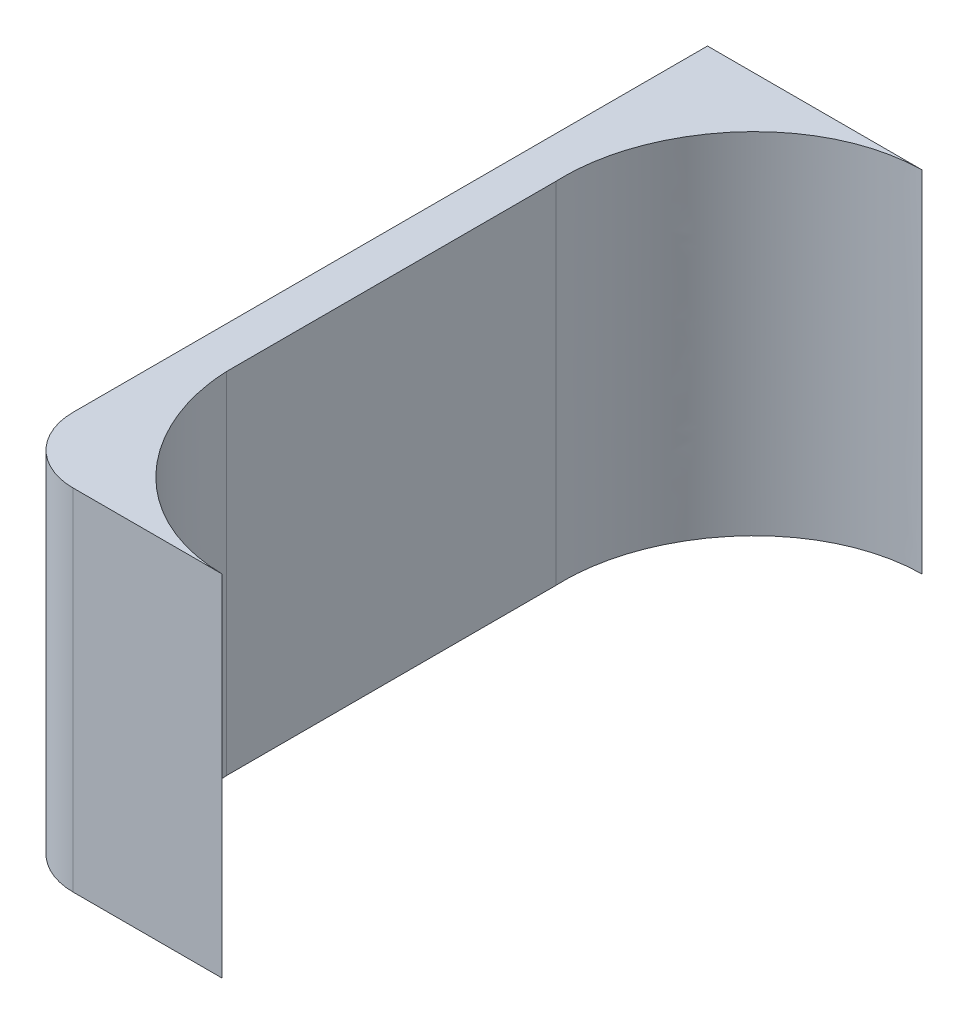
ISO-10303-21;
HEADER;
FILE_DESCRIPTION(('STEP AP214'),'2;1');
FILE_NAME('part.step','',(''),(''),'','','');
FILE_SCHEMA(('AUTOMOTIVE_DESIGN { 1 0 10303 214 1 1 1 1 }'));
ENDSEC;
DATA;
#1=APPLICATION_CONTEXT('core data for automotive mechanical design processes');
#2=APPLICATION_PROTOCOL_DEFINITION('international standard','automotive_design',2000,#1);
#3=PRODUCT_CONTEXT('',#1,'mechanical');
#4=PRODUCT('Part','Part','',(#3));
#5=PRODUCT_RELATED_PRODUCT_CATEGORY('part','',(#4));
#6=PRODUCT_DEFINITION_FORMATION('','',#4);
#7=PRODUCT_DEFINITION_CONTEXT('part definition',#1,'design');
#8=PRODUCT_DEFINITION('design','',#6,#7);
#9=PRODUCT_DEFINITION_SHAPE('','',#8);
#10=(LENGTH_UNIT() NAMED_UNIT(*) SI_UNIT(.MILLI.,.METRE.));
#11=(NAMED_UNIT(*) PLANE_ANGLE_UNIT() SI_UNIT($,.RADIAN.));
#12=(NAMED_UNIT(*) SI_UNIT($,.STERADIAN.) SOLID_ANGLE_UNIT());
#13=UNCERTAINTY_MEASURE_WITH_UNIT(LENGTH_MEASURE(1.E-05),#10,'distance_accuracy_value','');
#14=(GEOMETRIC_REPRESENTATION_CONTEXT(3) GLOBAL_UNCERTAINTY_ASSIGNED_CONTEXT((#13)) GLOBAL_UNIT_ASSIGNED_CONTEXT((#10,
#11,#12)) REPRESENTATION_CONTEXT('',''));
#15=CARTESIAN_POINT('',(0.,0.,0.));
#16=DIRECTION('',(0.,0.,1.));
#17=DIRECTION('',(1.,0.,0.));
#18=AXIS2_PLACEMENT_3D('',#15,#16,#17);
#19=CARTESIAN_POINT('',(0.,0.,160.));
#20=DIRECTION('',(0.,0.,1.));
#21=DIRECTION('',(1.,0.,0.));
#22=AXIS2_PLACEMENT_3D('',#19,#20,#21);
#23=PLANE('',#22);
#24=DIRECTION('',(-1.,0.,0.));
#25=VECTOR('',#24,1.);
#26=CARTESIAN_POINT('',(-30.,40.,160.));
#27=LINE('',#26,#25);
#28=CARTESIAN_POINT('',(19.,40.,160.));
#29=VERTEX_POINT('',#28);
#30=CARTESIAN_POINT('',(-15.,40.,160.));
#31=VERTEX_POINT('',#30);
#32=EDGE_CURVE('E178',#29,#31,#27,.T.);
#33=ORIENTED_EDGE('',*,*,#32,.T.);
#34=DIRECTION('',(0.,-1.,0.));
#35=VECTOR('',#34,1.);
#36=CARTESIAN_POINT('',(-15.,-40.,160.));
#37=LINE('',#36,#35);
#38=CARTESIAN_POINT('',(-15.,-40.,160.));
#39=VERTEX_POINT('',#38);
#40=EDGE_CURVE('E165',#31,#39,#37,.T.);
#41=ORIENTED_EDGE('',*,*,#40,.T.);
#42=DIRECTION('',(1.,0.,0.));
#43=VECTOR('',#42,1.);
#44=CARTESIAN_POINT('',(-30.,-40.,160.));
#45=LINE('',#44,#43);
#46=CARTESIAN_POINT('',(19.,-40.,160.));
#47=VERTEX_POINT('',#46);
#48=EDGE_CURVE('E175',#39,#47,#45,.T.);
#49=ORIENTED_EDGE('',*,*,#48,.T.);
#50=DIRECTION('',(0.,1.,0.));
#51=VECTOR('',#50,1.);
#52=CARTESIAN_POINT('',(19.,-40.,160.));
#53=LINE('',#52,#51);
#54=EDGE_CURVE('E101',#47,#29,#53,.T.);
#55=ORIENTED_EDGE('',*,*,#54,.T.);
#56=EDGE_LOOP('',(#33,#41,#49,#55));
#57=FACE_BOUND('',#56,.T.);
#58=ADVANCED_FACE('F38',(#57),#23,.T.);
#59=CARTESIAN_POINT('',(-30.,40.,160.));
#60=DIRECTION('',(0.,-1.,0.));
#61=DIRECTION('',(0.,0.,-1.));
#62=AXIS2_PLACEMENT_3D('',#59,#60,#61);
#63=PLANE('',#62);
#64=DIRECTION('',(0.,0.,-1.));
#65=VECTOR('',#64,1.);
#66=CARTESIAN_POINT('',(-30.,40.,160.));
#67=LINE('',#66,#65);
#68=CARTESIAN_POINT('',(-30.,40.,145.));
#69=VERTEX_POINT('',#68);
#70=CARTESIAN_POINT('',(-30.,40.,0.));
#71=VERTEX_POINT('',#70);
#72=EDGE_CURVE('E156',#69,#71,#67,.T.);
#73=ORIENTED_EDGE('',*,*,#72,.F.);
#74=CARTESIAN_POINT('',(-15.,40.,145.));
#75=DIRECTION('',(0.,-1.,0.));
#76=DIRECTION('',(0.,0.,-1.));
#77=AXIS2_PLACEMENT_3D('',#74,#75,#76);
#78=CIRCLE('',#77,15.);
#79=EDGE_CURVE('E12',#69,#31,#78,.F.);
#80=ORIENTED_EDGE('',*,*,#79,.T.);
#81=ORIENTED_EDGE('',*,*,#32,.F.);
#82=CARTESIAN_POINT('',(19.,40.,160.));
#83=CARTESIAN_POINT('',(-4.37071360719867,40.,159.593825672264));
#84=CARTESIAN_POINT('',(-21.4956227820202,40.,137.882573984809));
#85=CARTESIAN_POINT('',(-20.5384268178221,40.,115.946233739978));
#86=B_SPLINE_CURVE_WITH_KNOTS('',3,(#82,#83,#84,#85),.UNSPECIFIED.,.F.,.F.,(4,4),(0.,1.),.UNSPECIFIED.);
#87=CARTESIAN_POINT('',(-20.5384268178221,40.,119.465924684291));
#88=VERTEX_POINT('',#87);
#89=EDGE_CURVE('E119',#29,#88,#86,.T.);
#90=ORIENTED_EDGE('',*,*,#89,.T.);
#91=DIRECTION('',(0.,0.,1.));
#92=VECTOR('',#91,1.);
#93=CARTESIAN_POINT('',(-20.5384268178221,40.,0.));
#94=LINE('',#93,#92);
#95=CARTESIAN_POINT('',(-20.5384268178221,40.,44.0537662600225));
#96=VERTEX_POINT('',#95);
#97=EDGE_CURVE('E111',#96,#88,#94,.T.);
#98=ORIENTED_EDGE('',*,*,#97,.F.);
#99=CARTESIAN_POINT('',(19.,40.,0.));
#100=CARTESIAN_POINT('',(-4.37071360719869,40.,0.406174327736442));
#101=CARTESIAN_POINT('',(-21.4956227820202,40.,22.1174260151912));
#102=CARTESIAN_POINT('',(-20.5384268178221,40.,44.0537662600225));
#103=B_SPLINE_CURVE_WITH_KNOTS('',3,(#99,#100,#101,#102),.UNSPECIFIED.,.F.,.F.,(4,4),(0.,1.),.UNSPECIFIED.);
#104=CARTESIAN_POINT('',(19.,40.,0.));
#105=VERTEX_POINT('',#104);
#106=EDGE_CURVE('E116',#105,#96,#103,.T.);
#107=ORIENTED_EDGE('',*,*,#106,.F.);
#108=DIRECTION('',(-1.,0.,0.));
#109=VECTOR('',#108,1.);
#110=CARTESIAN_POINT('',(-30.,40.,0.));
#111=LINE('',#110,#109);
#112=EDGE_CURVE('E162',#105,#71,#111,.T.);
#113=ORIENTED_EDGE('',*,*,#112,.T.);
#114=EDGE_LOOP('',(#73,#80,#81,#90,#98,#107,#113));
#115=FACE_BOUND('',#114,.T.);
#116=ADVANCED_FACE('F142',(#115),#63,.F.);
#117=CARTESIAN_POINT('',(-30.,40.,160.));
#118=DIRECTION('',(1.,0.,0.));
#119=DIRECTION('',(0.,1.,0.));
#120=AXIS2_PLACEMENT_3D('',#117,#118,#119);
#121=PLANE('',#120);
#122=DIRECTION('',(0.,0.,-1.));
#123=VECTOR('',#122,1.);
#124=CARTESIAN_POINT('',(-30.,-40.,160.));
#125=LINE('',#124,#123);
#126=CARTESIAN_POINT('',(-30.,-40.,145.));
#127=VERTEX_POINT('',#126);
#128=CARTESIAN_POINT('',(-30.,-40.,0.));
#129=VERTEX_POINT('',#128);
#130=EDGE_CURVE('E166',#127,#129,#125,.T.);
#131=ORIENTED_EDGE('',*,*,#130,.F.);
#132=DIRECTION('',(0.,-1.,0.));
#133=VECTOR('',#132,1.);
#134=CARTESIAN_POINT('',(-30.,40.,145.));
#135=LINE('',#134,#133);
#136=EDGE_CURVE('E46',#127,#69,#135,.F.);
#137=ORIENTED_EDGE('',*,*,#136,.T.);
#138=ORIENTED_EDGE('',*,*,#72,.T.);
#139=DIRECTION('',(0.,-1.,0.));
#140=VECTOR('',#139,1.);
#141=CARTESIAN_POINT('',(-30.,40.,0.));
#142=LINE('',#141,#140);
#143=EDGE_CURVE('E179',#71,#129,#142,.T.);
#144=ORIENTED_EDGE('',*,*,#143,.T.);
#145=EDGE_LOOP('',(#131,#137,#138,#144));
#146=FACE_BOUND('',#145,.T.);
#147=ADVANCED_FACE('F149',(#146),#121,.F.);
#148=CARTESIAN_POINT('',(-30.,-40.,160.));
#149=DIRECTION('',(0.,1.,0.));
#150=DIRECTION('',(0.,0.,1.));
#151=AXIS2_PLACEMENT_3D('',#148,#149,#150);
#152=PLANE('',#151);
#153=ORIENTED_EDGE('',*,*,#48,.F.);
#154=CARTESIAN_POINT('',(-15.,-40.,145.));
#155=DIRECTION('',(0.,1.,0.));
#156=DIRECTION('',(0.,0.,1.));
#157=AXIS2_PLACEMENT_3D('',#154,#155,#156);
#158=CIRCLE('',#157,15.);
#159=EDGE_CURVE('E60',#39,#127,#158,.F.);
#160=ORIENTED_EDGE('',*,*,#159,.T.);
#161=ORIENTED_EDGE('',*,*,#130,.T.);
#162=DIRECTION('',(1.,0.,0.));
#163=VECTOR('',#162,1.);
#164=CARTESIAN_POINT('',(-30.,-40.,0.));
#165=LINE('',#164,#163);
#166=CARTESIAN_POINT('',(19.,-40.,0.));
#167=VERTEX_POINT('',#166);
#168=EDGE_CURVE('E176',#129,#167,#165,.T.);
#169=ORIENTED_EDGE('',*,*,#168,.T.);
#170=CARTESIAN_POINT('',(19.,-40.,0.));
#171=CARTESIAN_POINT('',(-4.37071360719869,-40.,0.406174327736442));
#172=CARTESIAN_POINT('',(-21.4956227820202,-40.,22.1174260151912));
#173=CARTESIAN_POINT('',(-20.5384268178221,-40.,44.0537662600225));
#174=B_SPLINE_CURVE_WITH_KNOTS('',3,(#170,#171,#172,#173),.UNSPECIFIED.,.F.,.F.,(4,4),(0.,1.),.UNSPECIFIED.);
#175=CARTESIAN_POINT('',(-20.5384268178221,-40.,44.0537662600225));
#176=VERTEX_POINT('',#175);
#177=EDGE_CURVE('E103',#167,#176,#174,.T.);
#178=ORIENTED_EDGE('',*,*,#177,.T.);
#179=DIRECTION('',(0.,0.,1.));
#180=VECTOR('',#179,1.);
#181=CARTESIAN_POINT('',(-20.5384268178221,-40.,0.));
#182=LINE('',#181,#180);
#183=CARTESIAN_POINT('',(-20.5384268178221,-40.,119.465924684291));
#184=VERTEX_POINT('',#183);
#185=EDGE_CURVE('E104',#176,#184,#182,.T.);
#186=ORIENTED_EDGE('',*,*,#185,.T.);
#187=CARTESIAN_POINT('',(19.,-40.,160.));
#188=CARTESIAN_POINT('',(-4.37071360719867,-40.,159.593825672264));
#189=CARTESIAN_POINT('',(-21.4956227820202,-40.,137.882573984809));
#190=CARTESIAN_POINT('',(-20.5384268178221,-40.,115.946233739978));
#191=B_SPLINE_CURVE_WITH_KNOTS('',3,(#187,#188,#189,#190),.UNSPECIFIED.,.F.,.F.,(4,4),(0.,1.),.UNSPECIFIED.);
#192=EDGE_CURVE('E95',#47,#184,#191,.T.);
#193=ORIENTED_EDGE('',*,*,#192,.F.);
#194=EDGE_LOOP('',(#153,#160,#161,#169,#178,#186,#193));
#195=FACE_BOUND('',#194,.T.);
#196=ADVANCED_FACE('F114',(#195),#152,.F.);
#197=CARTESIAN_POINT('',(0.,0.,0.));
#198=DIRECTION('',(0.,0.,1.));
#199=DIRECTION('',(1.,0.,0.));
#200=AXIS2_PLACEMENT_3D('',#197,#198,#199);
#201=PLANE('',#200);
#202=ORIENTED_EDGE('',*,*,#112,.F.);
#203=DIRECTION('',(0.,1.,0.));
#204=VECTOR('',#203,1.);
#205=CARTESIAN_POINT('',(19.,-40.,0.));
#206=LINE('',#205,#204);
#207=EDGE_CURVE('E186',#167,#105,#206,.T.);
#208=ORIENTED_EDGE('',*,*,#207,.F.);
#209=ORIENTED_EDGE('',*,*,#168,.F.);
#210=ORIENTED_EDGE('',*,*,#143,.F.);
#211=EDGE_LOOP('',(#202,#208,#209,#210));
#212=FACE_BOUND('',#211,.T.);
#213=ADVANCED_FACE('F139',(#212),#201,.F.);
#214=CARTESIAN_POINT('',(-20.5384268178221,-40.,0.));
#215=DIRECTION('',(-1.,0.,0.));
#216=DIRECTION('',(0.,0.,1.));
#217=AXIS2_PLACEMENT_3D('',#214,#215,#216);
#218=PLANE('',#217);
#219=ORIENTED_EDGE('',*,*,#97,.T.);
#220=DIRECTION('',(0.,1.,0.));
#221=VECTOR('',#220,1.);
#222=CARTESIAN_POINT('',(-20.5384268178221,-40.,119.465924684291));
#223=LINE('',#222,#221);
#224=EDGE_CURVE('E98',#184,#88,#223,.T.);
#225=ORIENTED_EDGE('',*,*,#224,.F.);
#226=ORIENTED_EDGE('',*,*,#185,.F.);
#227=DIRECTION('',(0.,1.,0.));
#228=VECTOR('',#227,1.);
#229=CARTESIAN_POINT('',(-20.5384268178221,-40.,44.0537662600225));
#230=LINE('',#229,#228);
#231=EDGE_CURVE('E182',#176,#96,#230,.T.);
#232=ORIENTED_EDGE('',*,*,#231,.T.);
#233=EDGE_LOOP('',(#219,#225,#226,#232));
#234=FACE_BOUND('',#233,.T.);
#235=ADVANCED_FACE('F108',(#234),#218,.F.);
#236=DIRECTION('',(0.,1.,0.));
#237=VECTOR('',#236,1.);
#238=SURFACE_OF_LINEAR_EXTRUSION('',#174,#237);
#239=ORIENTED_EDGE('',*,*,#106,.T.);
#240=ORIENTED_EDGE('',*,*,#231,.F.);
#241=ORIENTED_EDGE('',*,*,#177,.F.);
#242=ORIENTED_EDGE('',*,*,#207,.T.);
#243=EDGE_LOOP('',(#239,#240,#241,#242));
#244=FACE_BOUND('',#243,.T.);
#245=ADVANCED_FACE('F136',(#244),#238,.F.);
#246=DIRECTION('',(0.,1.,0.));
#247=VECTOR('',#246,1.);
#248=SURFACE_OF_LINEAR_EXTRUSION('',#191,#247);
#249=ORIENTED_EDGE('',*,*,#89,.F.);
#250=ORIENTED_EDGE('',*,*,#54,.F.);
#251=ORIENTED_EDGE('',*,*,#192,.T.);
#252=ORIENTED_EDGE('',*,*,#224,.T.);
#253=EDGE_LOOP('',(#249,#250,#251,#252));
#254=FACE_BOUND('',#253,.T.);
#255=ADVANCED_FACE('F97',(#254),#248,.T.);
#256=CARTESIAN_POINT('',(-15.,0.,145.));
#257=DIRECTION('',(0.,1.,0.));
#258=DIRECTION('',(-1.,0.,0.));
#259=AXIS2_PLACEMENT_3D('',#256,#257,#258);
#260=CYLINDRICAL_SURFACE('',#259,15.);
#261=ORIENTED_EDGE('',*,*,#79,.F.);
#262=ORIENTED_EDGE('',*,*,#136,.F.);
#263=ORIENTED_EDGE('',*,*,#159,.F.);
#264=ORIENTED_EDGE('',*,*,#40,.F.);
#265=EDGE_LOOP('',(#261,#262,#263,#264));
#266=FACE_BOUND('',#265,.T.);
#267=ADVANCED_FACE('F40',(#266),#260,.T.);
#268=CLOSED_SHELL('',(#58,#116,#147,#196,#213,#235,#245,#255,#267));
#269=MANIFOLD_SOLID_BREP('B2',#268);
#270=ADVANCED_BREP_SHAPE_REPRESENTATION('',(#18,#269),#14);
#271=SHAPE_DEFINITION_REPRESENTATION(#9,#270);
ENDSEC;
END-ISO-10303-21;
